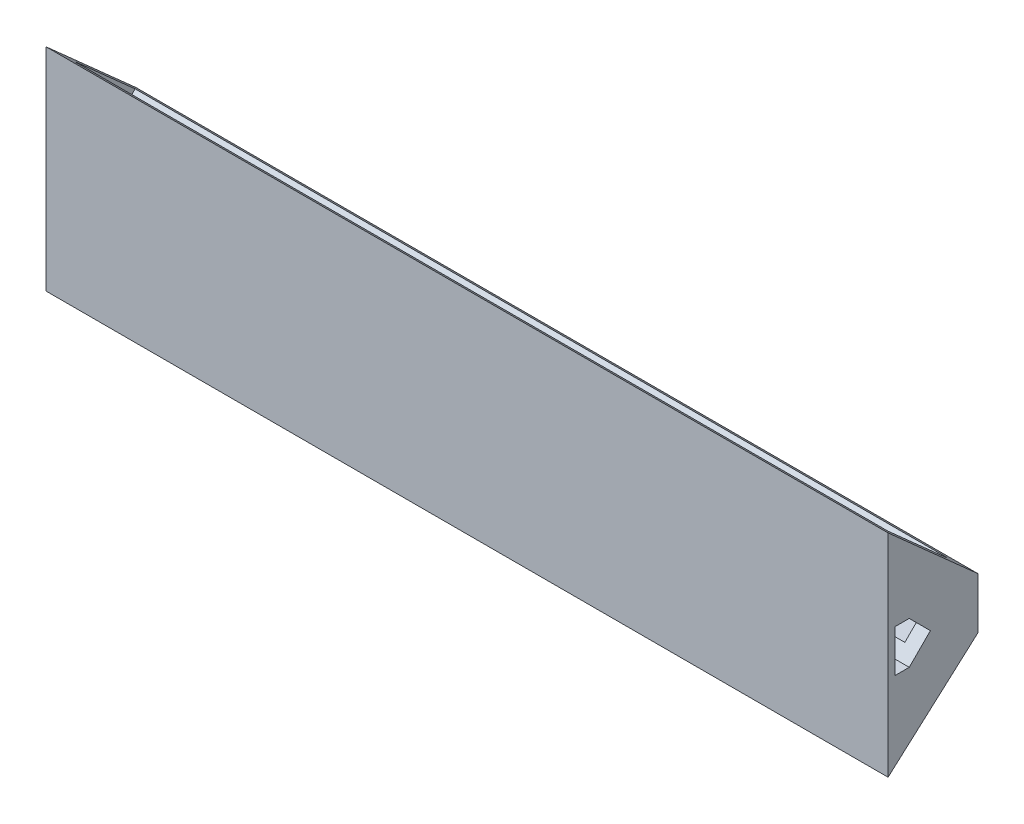
ISO-10303-21;
HEADER;
FILE_DESCRIPTION(('STEP AP214'),'2;1');
FILE_NAME('part.step','',(''),(''),'','','');
FILE_SCHEMA(('AUTOMOTIVE_DESIGN { 1 0 10303 214 1 1 1 1 }'));
ENDSEC;
DATA;
#1=APPLICATION_CONTEXT('core data for automotive mechanical design processes');
#2=APPLICATION_PROTOCOL_DEFINITION('international standard','automotive_design',2000,#1);
#3=PRODUCT_CONTEXT('',#1,'mechanical');
#4=PRODUCT('Part','Part','',(#3));
#5=PRODUCT_RELATED_PRODUCT_CATEGORY('part','',(#4));
#6=PRODUCT_DEFINITION_FORMATION('','',#4);
#7=PRODUCT_DEFINITION_CONTEXT('part definition',#1,'design');
#8=PRODUCT_DEFINITION('design','',#6,#7);
#9=PRODUCT_DEFINITION_SHAPE('','',#8);
#10=(LENGTH_UNIT() NAMED_UNIT(*) SI_UNIT(.MILLI.,.METRE.));
#11=(NAMED_UNIT(*) PLANE_ANGLE_UNIT() SI_UNIT($,.RADIAN.));
#12=(NAMED_UNIT(*) SI_UNIT($,.STERADIAN.) SOLID_ANGLE_UNIT());
#13=UNCERTAINTY_MEASURE_WITH_UNIT(LENGTH_MEASURE(1.E-05),#10,'distance_accuracy_value','');
#14=(GEOMETRIC_REPRESENTATION_CONTEXT(3) GLOBAL_UNCERTAINTY_ASSIGNED_CONTEXT((#13)) GLOBAL_UNIT_ASSIGNED_CONTEXT((#10,
#11,#12)) REPRESENTATION_CONTEXT('',''));
#15=CARTESIAN_POINT('',(0.,0.,0.));
#16=DIRECTION('',(0.,0.,1.));
#17=DIRECTION('',(1.,0.,0.));
#18=AXIS2_PLACEMENT_3D('',#15,#16,#17);
#19=CARTESIAN_POINT('',(119.4,7.24999999999998,0.));
#20=DIRECTION('',(0.,-0.746197209604912,0.665724961510265));
#21=DIRECTION('',(0.,-0.665724961510265,-0.746197209604912));
#22=AXIS2_PLACEMENT_3D('',#19,#20,#21);
#23=PLANE('',#22);
#24=DIRECTION('',(-1.,0.,0.));
#25=VECTOR('',#24,1.);
#26=CARTESIAN_POINT('',(119.4,7.24999999999998,0.));
#27=LINE('',#26,#25);
#28=CARTESIAN_POINT('',(119.4,7.24999999999998,0.));
#29=VERTEX_POINT('',#28);
#30=CARTESIAN_POINT('',(-119.4,7.24999999999998,0.));
#31=VERTEX_POINT('',#30);
#32=EDGE_CURVE('E171',#29,#31,#27,.T.);
#33=ORIENTED_EDGE('',*,*,#32,.T.);
#34=DIRECTION('',(0.,0.665724961510265,0.746197209604912));
#35=VECTOR('',#34,1.);
#36=CARTESIAN_POINT('',(-119.4,7.24999999999998,0.));
#37=LINE('',#36,#35);
#38=CARTESIAN_POINT('',(-119.4,30.,25.5));
#39=VERTEX_POINT('',#38);
#40=EDGE_CURVE('E252',#31,#39,#37,.T.);
#41=ORIENTED_EDGE('',*,*,#40,.T.);
#42=DIRECTION('',(-1.,0.,0.));
#43=VECTOR('',#42,1.);
#44=CARTESIAN_POINT('',(119.4,30.,25.5));
#45=LINE('',#44,#43);
#46=CARTESIAN_POINT('',(119.4,30.,25.5));
#47=VERTEX_POINT('',#46);
#48=EDGE_CURVE('E175',#47,#39,#45,.T.);
#49=ORIENTED_EDGE('',*,*,#48,.F.);
#50=DIRECTION('',(0.,0.665724961510265,0.746197209604912));
#51=VECTOR('',#50,1.);
#52=CARTESIAN_POINT('',(119.4,7.24999999999998,0.));
#53=LINE('',#52,#51);
#54=EDGE_CURVE('E195',#29,#47,#53,.T.);
#55=ORIENTED_EDGE('',*,*,#54,.F.);
#56=EDGE_LOOP('',(#33,#41,#49,#55));
#57=FACE_BOUND('',#56,.T.);
#58=DIRECTION('',(0.,0.665724961510265,0.746197209604912));
#59=VECTOR('',#58,1.);
#60=CARTESIAN_POINT('',(-115.4,4.03687449826062,-3.60152528766389));
#61=LINE('',#60,#59);
#62=CARTESIAN_POINT('',(-115.4,11.0220207253886,4.22797927461143));
#63=VERTEX_POINT('',#62);
#64=CARTESIAN_POINT('',(-115.4,26.4313725490196,21.5));
#65=VERTEX_POINT('',#64);
#66=EDGE_CURVE('E345',#63,#65,#61,.T.);
#67=ORIENTED_EDGE('',*,*,#66,.F.);
#68=DIRECTION('',(-1.,0.,0.));
#69=VECTOR('',#68,1.);
#70=CARTESIAN_POINT('',(119.4,11.0220207253886,4.22797927461143));
#71=LINE('',#70,#69);
#72=CARTESIAN_POINT('',(115.4,11.0220207253886,4.22797927461143));
#73=VERTEX_POINT('',#72);
#74=EDGE_CURVE('E11',#63,#73,#71,.F.);
#75=ORIENTED_EDGE('',*,*,#74,.T.);
#76=DIRECTION('',(0.,0.665724961510265,0.746197209604912));
#77=VECTOR('',#76,1.);
#78=CARTESIAN_POINT('',(115.4,4.03687449826062,-3.60152528766389));
#79=LINE('',#78,#77);
#80=CARTESIAN_POINT('',(115.4,26.4313725490196,21.5));
#81=VERTEX_POINT('',#80);
#82=EDGE_CURVE('E106',#73,#81,#79,.T.);
#83=ORIENTED_EDGE('',*,*,#82,.T.);
#84=DIRECTION('',(-1.,0.,0.));
#85=VECTOR('',#84,1.);
#86=CARTESIAN_POINT('',(119.4,26.4313725490196,21.5));
#87=LINE('',#86,#85);
#88=EDGE_CURVE('E340',#81,#65,#87,.T.);
#89=ORIENTED_EDGE('',*,*,#88,.T.);
#90=EDGE_LOOP('',(#67,#75,#83,#89));
#91=FACE_BOUND('',#90,.T.);
#92=ADVANCED_FACE('F42',(#57,#91),#23,.F.);
#93=CARTESIAN_POINT('',(119.4,-7.25000000000002,0.));
#94=DIRECTION('',(0.,0.746197209604912,0.665724961510264));
#95=DIRECTION('',(0.,-0.665724961510264,0.746197209604912));
#96=AXIS2_PLACEMENT_3D('',#93,#94,#95);
#97=PLANE('',#96);
#98=DIRECTION('',(-1.,0.,0.));
#99=VECTOR('',#98,1.);
#100=CARTESIAN_POINT('',(119.4,-30.,25.5));
#101=LINE('',#100,#99);
#102=CARTESIAN_POINT('',(119.4,-30.,25.5));
#103=VERTEX_POINT('',#102);
#104=CARTESIAN_POINT('',(-119.4,-30.,25.5));
#105=VERTEX_POINT('',#104);
#106=EDGE_CURVE('E179',#103,#105,#101,.T.);
#107=ORIENTED_EDGE('',*,*,#106,.T.);
#108=DIRECTION('',(0.,0.665724961510264,-0.746197209604912));
#109=VECTOR('',#108,1.);
#110=CARTESIAN_POINT('',(-119.4,-7.25000000000002,0.));
#111=LINE('',#110,#109);
#112=CARTESIAN_POINT('',(-119.4,-7.25000000000002,0.));
#113=VERTEX_POINT('',#112);
#114=EDGE_CURVE('E244',#105,#113,#111,.T.);
#115=ORIENTED_EDGE('',*,*,#114,.T.);
#116=DIRECTION('',(-1.,0.,0.));
#117=VECTOR('',#116,1.);
#118=CARTESIAN_POINT('',(119.4,-7.25000000000002,0.));
#119=LINE('',#118,#117);
#120=CARTESIAN_POINT('',(119.4,-7.25000000000002,0.));
#121=VERTEX_POINT('',#120);
#122=EDGE_CURVE('E183',#121,#113,#119,.T.);
#123=ORIENTED_EDGE('',*,*,#122,.F.);
#124=DIRECTION('',(0.,0.665724961510264,-0.746197209604912));
#125=VECTOR('',#124,1.);
#126=CARTESIAN_POINT('',(119.4,-7.25000000000002,0.));
#127=LINE('',#126,#125);
#128=EDGE_CURVE('E187',#103,#121,#127,.T.);
#129=ORIENTED_EDGE('',*,*,#128,.F.);
#130=EDGE_LOOP('',(#107,#115,#123,#129));
#131=FACE_BOUND('',#130,.T.);
#132=DIRECTION('',(-1.,0.,0.));
#133=VECTOR('',#132,1.);
#134=CARTESIAN_POINT('',(119.4,-26.4313725490196,21.5));
#135=LINE('',#134,#133);
#136=CARTESIAN_POINT('',(115.4,-26.4313725490196,21.5));
#137=VERTEX_POINT('',#136);
#138=CARTESIAN_POINT('',(-115.4,-26.4313725490196,21.5));
#139=VERTEX_POINT('',#138);
#140=EDGE_CURVE('E344',#137,#139,#135,.T.);
#141=ORIENTED_EDGE('',*,*,#140,.F.);
#142=DIRECTION('',(0.,0.665724961510264,-0.746197209604912));
#143=VECTOR('',#142,1.);
#144=CARTESIAN_POINT('',(115.4,-4.03687449826065,-3.60152528766391));
#145=LINE('',#144,#143);
#146=CARTESIAN_POINT('',(115.4,-11.0220207253886,4.22797927461142));
#147=VERTEX_POINT('',#146);
#148=EDGE_CURVE('E134',#137,#147,#145,.T.);
#149=ORIENTED_EDGE('',*,*,#148,.T.);
#150=DIRECTION('',(-1.,0.,0.));
#151=VECTOR('',#150,1.);
#152=CARTESIAN_POINT('',(119.4,-11.0220207253886,4.22797927461142));
#153=LINE('',#152,#151);
#154=CARTESIAN_POINT('',(-115.4,-11.0220207253886,4.22797927461142));
#155=VERTEX_POINT('',#154);
#156=EDGE_CURVE('E52',#147,#155,#153,.T.);
#157=ORIENTED_EDGE('',*,*,#156,.T.);
#158=DIRECTION('',(0.,0.665724961510264,-0.746197209604912));
#159=VECTOR('',#158,1.);
#160=CARTESIAN_POINT('',(-115.4,-4.03687449826065,-3.60152528766391));
#161=LINE('',#160,#159);
#162=EDGE_CURVE('E133',#139,#155,#161,.T.);
#163=ORIENTED_EDGE('',*,*,#162,.F.);
#164=EDGE_LOOP('',(#141,#149,#157,#163));
#165=FACE_BOUND('',#164,.T.);
#166=ADVANCED_FACE('F131',(#131,#165),#97,.F.);
#167=CARTESIAN_POINT('',(119.4,7.24999999999998,0.));
#168=DIRECTION('',(0.,0.,1.));
#169=DIRECTION('',(1.,0.,0.));
#170=AXIS2_PLACEMENT_3D('',#167,#168,#169);
#171=PLANE('',#170);
#172=ORIENTED_EDGE('',*,*,#122,.T.);
#173=DIRECTION('',(0.,1.,0.));
#174=VECTOR('',#173,1.);
#175=CARTESIAN_POINT('',(-119.4,7.24999999999998,0.));
#176=LINE('',#175,#174);
#177=EDGE_CURVE('E256',#113,#31,#176,.T.);
#178=ORIENTED_EDGE('',*,*,#177,.T.);
#179=ORIENTED_EDGE('',*,*,#32,.F.);
#180=DIRECTION('',(0.,1.,0.));
#181=VECTOR('',#180,1.);
#182=CARTESIAN_POINT('',(119.4,7.24999999999998,0.));
#183=LINE('',#182,#181);
#184=EDGE_CURVE('E199',#121,#29,#183,.T.);
#185=ORIENTED_EDGE('',*,*,#184,.F.);
#186=EDGE_LOOP('',(#172,#178,#179,#185));
#187=FACE_BOUND('',#186,.T.);
#188=DIRECTION('',(0.,-1.,0.));
#189=VECTOR('',#188,1.);
#190=CARTESIAN_POINT('',(-115.4,3.24999999999998,0.));
#191=LINE('',#190,#189);
#192=CARTESIAN_POINT('',(-115.4,3.24999999999998,0.));
#193=VERTEX_POINT('',#192);
#194=CARTESIAN_POINT('',(-115.4,-3.25000000000002,0.));
#195=VERTEX_POINT('',#194);
#196=EDGE_CURVE('E118',#193,#195,#191,.T.);
#197=ORIENTED_EDGE('',*,*,#196,.T.);
#198=DIRECTION('',(1.,0.,0.));
#199=VECTOR('',#198,1.);
#200=CARTESIAN_POINT('',(-115.4,-3.25000000000002,0.));
#201=LINE('',#200,#199);
#202=CARTESIAN_POINT('',(115.4,-3.25000000000002,0.));
#203=VERTEX_POINT('',#202);
#204=EDGE_CURVE('E312',#195,#203,#201,.T.);
#205=ORIENTED_EDGE('',*,*,#204,.T.);
#206=DIRECTION('',(0.,-1.,0.));
#207=VECTOR('',#206,1.);
#208=CARTESIAN_POINT('',(115.4,3.24999999999998,0.));
#209=LINE('',#208,#207);
#210=CARTESIAN_POINT('',(115.4,3.24999999999998,0.));
#211=VERTEX_POINT('',#210);
#212=EDGE_CURVE('E308',#211,#203,#209,.T.);
#213=ORIENTED_EDGE('',*,*,#212,.F.);
#214=DIRECTION('',(1.,0.,0.));
#215=VECTOR('',#214,1.);
#216=CARTESIAN_POINT('',(-115.4,3.24999999999998,0.));
#217=LINE('',#216,#215);
#218=EDGE_CURVE('E304',#193,#211,#217,.T.);
#219=ORIENTED_EDGE('',*,*,#218,.F.);
#220=EDGE_LOOP('',(#197,#205,#213,#219));
#221=FACE_BOUND('',#220,.T.);
#222=ADVANCED_FACE('F440',(#187,#221),#171,.F.);
#223=CARTESIAN_POINT('',(119.4,-6.,19.5));
#224=DIRECTION('',(0.,0.707106781186546,0.707106781186549));
#225=DIRECTION('',(0.,-0.707106781186549,0.707106781186546));
#226=AXIS2_PLACEMENT_3D('',#223,#224,#225);
#227=PLANE('',#226);
#228=DIRECTION('',(-1.,0.,0.));
#229=VECTOR('',#228,1.);
#230=CARTESIAN_POINT('',(119.4,-3.25000000000002,16.75));
#231=LINE('',#230,#229);
#232=CARTESIAN_POINT('',(115.4,-3.25000000000002,16.75));
#233=VERTEX_POINT('',#232);
#234=CARTESIAN_POINT('',(-115.4,-3.25000000000002,16.75));
#235=VERTEX_POINT('',#234);
#236=EDGE_CURVE('E155',#233,#235,#231,.T.);
#237=ORIENTED_EDGE('',*,*,#236,.T.);
#238=DIRECTION('',(0.,0.707106781186549,-0.707106781186546));
#239=VECTOR('',#238,1.);
#240=CARTESIAN_POINT('',(-115.4,-6.,19.5));
#241=LINE('',#240,#239);
#242=CARTESIAN_POINT('',(-115.4,0.,13.5));
#243=VERTEX_POINT('',#242);
#244=EDGE_CURVE('E280',#235,#243,#241,.T.);
#245=ORIENTED_EDGE('',*,*,#244,.T.);
#246=DIRECTION('',(-1.,0.,0.));
#247=VECTOR('',#246,1.);
#248=CARTESIAN_POINT('',(119.4,0.,13.5));
#249=LINE('',#248,#247);
#250=CARTESIAN_POINT('',(-119.4,0.,13.5));
#251=VERTEX_POINT('',#250);
#252=EDGE_CURVE('E219',#243,#251,#249,.T.);
#253=ORIENTED_EDGE('',*,*,#252,.T.);
#254=DIRECTION('',(0.,0.707106781186549,-0.707106781186546));
#255=VECTOR('',#254,1.);
#256=CARTESIAN_POINT('',(-119.4,-6.,19.5));
#257=LINE('',#256,#255);
#258=CARTESIAN_POINT('',(-119.4,-6.,19.5));
#259=VERTEX_POINT('',#258);
#260=EDGE_CURVE('E264',#259,#251,#257,.T.);
#261=ORIENTED_EDGE('',*,*,#260,.F.);
#262=DIRECTION('',(-1.,0.,0.));
#263=VECTOR('',#262,1.);
#264=CARTESIAN_POINT('',(119.4,-6.,19.5));
#265=LINE('',#264,#263);
#266=CARTESIAN_POINT('',(119.4,-6.,19.5));
#267=VERTEX_POINT('',#266);
#268=EDGE_CURVE('E211',#267,#259,#265,.T.);
#269=ORIENTED_EDGE('',*,*,#268,.F.);
#270=DIRECTION('',(0.,0.707106781186549,-0.707106781186546));
#271=VECTOR('',#270,1.);
#272=CARTESIAN_POINT('',(119.4,-6.,19.5));
#273=LINE('',#272,#271);
#274=CARTESIAN_POINT('',(119.4,0.,13.5));
#275=VERTEX_POINT('',#274);
#276=EDGE_CURVE('E228',#267,#275,#273,.T.);
#277=ORIENTED_EDGE('',*,*,#276,.T.);
#278=CARTESIAN_POINT('',(115.4,0.,13.5));
#279=VERTEX_POINT('',#278);
#280=EDGE_CURVE('E215',#275,#279,#249,.T.);
#281=ORIENTED_EDGE('',*,*,#280,.T.);
#282=DIRECTION('',(0.,0.707106781186549,-0.707106781186546));
#283=VECTOR('',#282,1.);
#284=CARTESIAN_POINT('',(115.4,-6.,19.5));
#285=LINE('',#284,#283);
#286=EDGE_CURVE('E284',#233,#279,#285,.T.);
#287=ORIENTED_EDGE('',*,*,#286,.F.);
#288=EDGE_LOOP('',(#237,#245,#253,#261,#269,#277,#281,#287));
#289=FACE_BOUND('',#288,.T.);
#290=ADVANCED_FACE('F448',(#289),#227,.T.);
#291=CARTESIAN_POINT('',(119.4,6.,19.5));
#292=DIRECTION('',(0.,-0.707106781186546,0.707106781186549));
#293=DIRECTION('',(0.,-0.707106781186549,-0.707106781186546));
#294=AXIS2_PLACEMENT_3D('',#291,#292,#293);
#295=PLANE('',#294);
#296=ORIENTED_EDGE('',*,*,#252,.F.);
#297=DIRECTION('',(0.,0.707106781186549,0.707106781186546));
#298=VECTOR('',#297,1.);
#299=CARTESIAN_POINT('',(-115.4,6.,19.5));
#300=LINE('',#299,#298);
#301=CARTESIAN_POINT('',(-115.4,3.24999999999998,16.75));
#302=VERTEX_POINT('',#301);
#303=EDGE_CURVE('E159',#243,#302,#300,.T.);
#304=ORIENTED_EDGE('',*,*,#303,.T.);
#305=DIRECTION('',(-1.,0.,0.));
#306=VECTOR('',#305,1.);
#307=CARTESIAN_POINT('',(119.4,3.24999999999998,16.75));
#308=LINE('',#307,#306);
#309=CARTESIAN_POINT('',(115.4,3.24999999999998,16.75));
#310=VERTEX_POINT('',#309);
#311=EDGE_CURVE('E167',#310,#302,#308,.T.);
#312=ORIENTED_EDGE('',*,*,#311,.F.);
#313=DIRECTION('',(0.,0.707106781186549,0.707106781186546));
#314=VECTOR('',#313,1.);
#315=CARTESIAN_POINT('',(115.4,6.,19.5));
#316=LINE('',#315,#314);
#317=EDGE_CURVE('E163',#279,#310,#316,.T.);
#318=ORIENTED_EDGE('',*,*,#317,.F.);
#319=ORIENTED_EDGE('',*,*,#280,.F.);
#320=DIRECTION('',(0.,0.707106781186549,0.707106781186546));
#321=VECTOR('',#320,1.);
#322=CARTESIAN_POINT('',(119.4,6.,19.5));
#323=LINE('',#322,#321);
#324=CARTESIAN_POINT('',(119.4,6.,19.5));
#325=VERTEX_POINT('',#324);
#326=EDGE_CURVE('E224',#275,#325,#323,.T.);
#327=ORIENTED_EDGE('',*,*,#326,.T.);
#328=DIRECTION('',(-1.,0.,0.));
#329=VECTOR('',#328,1.);
#330=CARTESIAN_POINT('',(119.4,6.,19.5));
#331=LINE('',#330,#329);
#332=CARTESIAN_POINT('',(-119.4,6.,19.5));
#333=VERTEX_POINT('',#332);
#334=EDGE_CURVE('E220',#325,#333,#331,.T.);
#335=ORIENTED_EDGE('',*,*,#334,.T.);
#336=DIRECTION('',(0.,0.707106781186549,0.707106781186546));
#337=VECTOR('',#336,1.);
#338=CARTESIAN_POINT('',(-119.4,6.,19.5));
#339=LINE('',#338,#337);
#340=EDGE_CURVE('E260',#251,#333,#339,.T.);
#341=ORIENTED_EDGE('',*,*,#340,.F.);
#342=EDGE_LOOP('',(#296,#304,#312,#318,#319,#327,#335,#341));
#343=FACE_BOUND('',#342,.T.);
#344=ADVANCED_FACE('F609',(#343),#295,.T.);
#345=CARTESIAN_POINT('',(119.4,0.,0.));
#346=DIRECTION('',(-1.,0.,0.));
#347=DIRECTION('',(0.,0.,1.));
#348=AXIS2_PLACEMENT_3D('',#345,#346,#347);
#349=PLANE('',#348);
#350=ORIENTED_EDGE('',*,*,#184,.T.);
#351=ORIENTED_EDGE('',*,*,#54,.T.);
#352=DIRECTION('',(0.,-1.,0.));
#353=VECTOR('',#352,1.);
#354=CARTESIAN_POINT('',(119.4,30.,25.5));
#355=LINE('',#354,#353);
#356=EDGE_CURVE('E191',#47,#103,#355,.T.);
#357=ORIENTED_EDGE('',*,*,#356,.T.);
#358=ORIENTED_EDGE('',*,*,#128,.T.);
#359=EDGE_LOOP('',(#350,#351,#357,#358));
#360=FACE_BOUND('',#359,.T.);
#361=DIRECTION('',(0.,0.,1.));
#362=VECTOR('',#361,1.);
#363=CARTESIAN_POINT('',(119.4,6.,23.5));
#364=LINE('',#363,#362);
#365=CARTESIAN_POINT('',(119.4,6.,23.5));
#366=VERTEX_POINT('',#365);
#367=EDGE_CURVE('E240',#325,#366,#364,.T.);
#368=ORIENTED_EDGE('',*,*,#367,.F.);
#369=ORIENTED_EDGE('',*,*,#326,.F.);
#370=ORIENTED_EDGE('',*,*,#276,.F.);
#371=DIRECTION('',(0.,0.,-1.));
#372=VECTOR('',#371,1.);
#373=CARTESIAN_POINT('',(119.4,-6.,23.5));
#374=LINE('',#373,#372);
#375=CARTESIAN_POINT('',(119.4,-6.,23.5));
#376=VERTEX_POINT('',#375);
#377=EDGE_CURVE('E232',#376,#267,#374,.T.);
#378=ORIENTED_EDGE('',*,*,#377,.F.);
#379=DIRECTION('',(0.,-1.,0.));
#380=VECTOR('',#379,1.);
#381=CARTESIAN_POINT('',(119.4,6.,23.5));
#382=LINE('',#381,#380);
#383=EDGE_CURVE('E236',#366,#376,#382,.T.);
#384=ORIENTED_EDGE('',*,*,#383,.F.);
#385=EDGE_LOOP('',(#368,#369,#370,#378,#384));
#386=FACE_BOUND('',#385,.T.);
#387=ADVANCED_FACE('F614',(#360,#386),#349,.F.);
#388=CARTESIAN_POINT('',(119.4,30.,25.5));
#389=DIRECTION('',(0.,0.,-1.));
#390=DIRECTION('',(-1.,0.,0.));
#391=AXIS2_PLACEMENT_3D('',#388,#389,#390);
#392=PLANE('',#391);
#393=ORIENTED_EDGE('',*,*,#48,.T.);
#394=DIRECTION('',(0.,-1.,0.));
#395=VECTOR('',#394,1.);
#396=CARTESIAN_POINT('',(-119.4,30.,25.5));
#397=LINE('',#396,#395);
#398=EDGE_CURVE('E248',#39,#105,#397,.T.);
#399=ORIENTED_EDGE('',*,*,#398,.T.);
#400=ORIENTED_EDGE('',*,*,#106,.F.);
#401=ORIENTED_EDGE('',*,*,#356,.F.);
#402=EDGE_LOOP('',(#393,#399,#400,#401));
#403=FACE_BOUND('',#402,.T.);
#404=ADVANCED_FACE('F446',(#403),#392,.F.);
#405=CARTESIAN_POINT('',(119.4,6.,23.5));
#406=DIRECTION('',(0.,-1.,0.));
#407=DIRECTION('',(0.,0.,-1.));
#408=AXIS2_PLACEMENT_3D('',#405,#406,#407);
#409=PLANE('',#408);
#410=DIRECTION('',(-1.,0.,0.));
#411=VECTOR('',#410,1.);
#412=CARTESIAN_POINT('',(119.4,6.,23.5));
#413=LINE('',#412,#411);
#414=CARTESIAN_POINT('',(-119.4,6.,23.5));
#415=VERTEX_POINT('',#414);
#416=EDGE_CURVE('E203',#366,#415,#413,.T.);
#417=ORIENTED_EDGE('',*,*,#416,.T.);
#418=DIRECTION('',(0.,0.,1.));
#419=VECTOR('',#418,1.);
#420=CARTESIAN_POINT('',(-119.4,6.,23.5));
#421=LINE('',#420,#419);
#422=EDGE_CURVE('E276',#333,#415,#421,.T.);
#423=ORIENTED_EDGE('',*,*,#422,.F.);
#424=ORIENTED_EDGE('',*,*,#334,.F.);
#425=ORIENTED_EDGE('',*,*,#367,.T.);
#426=EDGE_LOOP('',(#417,#423,#424,#425));
#427=FACE_BOUND('',#426,.T.);
#428=ADVANCED_FACE('F658',(#427),#409,.T.);
#429=CARTESIAN_POINT('',(119.4,6.,23.5));
#430=DIRECTION('',(0.,0.,-1.));
#431=DIRECTION('',(0.,1.,0.));
#432=AXIS2_PLACEMENT_3D('',#429,#430,#431);
#433=PLANE('',#432);
#434=DIRECTION('',(-1.,0.,0.));
#435=VECTOR('',#434,1.);
#436=CARTESIAN_POINT('',(119.4,-6.,23.5));
#437=LINE('',#436,#435);
#438=CARTESIAN_POINT('',(-119.4,-6.,23.5));
#439=VERTEX_POINT('',#438);
#440=EDGE_CURVE('E207',#376,#439,#437,.T.);
#441=ORIENTED_EDGE('',*,*,#440,.T.);
#442=DIRECTION('',(0.,-1.,0.));
#443=VECTOR('',#442,1.);
#444=CARTESIAN_POINT('',(-119.4,6.,23.5));
#445=LINE('',#444,#443);
#446=EDGE_CURVE('E272',#415,#439,#445,.T.);
#447=ORIENTED_EDGE('',*,*,#446,.F.);
#448=ORIENTED_EDGE('',*,*,#416,.F.);
#449=ORIENTED_EDGE('',*,*,#383,.T.);
#450=EDGE_LOOP('',(#441,#447,#448,#449));
#451=FACE_BOUND('',#450,.T.);
#452=ADVANCED_FACE('F648',(#451),#433,.T.);
#453=CARTESIAN_POINT('',(119.4,-6.,23.5));
#454=DIRECTION('',(0.,1.,0.));
#455=DIRECTION('',(0.,0.,1.));
#456=AXIS2_PLACEMENT_3D('',#453,#454,#455);
#457=PLANE('',#456);
#458=ORIENTED_EDGE('',*,*,#268,.T.);
#459=DIRECTION('',(0.,0.,-1.));
#460=VECTOR('',#459,1.);
#461=CARTESIAN_POINT('',(-119.4,-6.,23.5));
#462=LINE('',#461,#460);
#463=EDGE_CURVE('E268',#439,#259,#462,.T.);
#464=ORIENTED_EDGE('',*,*,#463,.F.);
#465=ORIENTED_EDGE('',*,*,#440,.F.);
#466=ORIENTED_EDGE('',*,*,#377,.T.);
#467=EDGE_LOOP('',(#458,#464,#465,#466));
#468=FACE_BOUND('',#467,.T.);
#469=ADVANCED_FACE('F638',(#468),#457,.T.);
#470=CARTESIAN_POINT('',(-119.4,0.,0.));
#471=DIRECTION('',(-1.,0.,0.));
#472=DIRECTION('',(0.,0.,1.));
#473=AXIS2_PLACEMENT_3D('',#470,#471,#472);
#474=PLANE('',#473);
#475=ORIENTED_EDGE('',*,*,#422,.T.);
#476=ORIENTED_EDGE('',*,*,#446,.T.);
#477=ORIENTED_EDGE('',*,*,#463,.T.);
#478=ORIENTED_EDGE('',*,*,#260,.T.);
#479=ORIENTED_EDGE('',*,*,#340,.T.);
#480=EDGE_LOOP('',(#475,#476,#477,#478,#479));
#481=FACE_BOUND('',#480,.T.);
#482=ORIENTED_EDGE('',*,*,#177,.F.);
#483=ORIENTED_EDGE('',*,*,#114,.F.);
#484=ORIENTED_EDGE('',*,*,#398,.F.);
#485=ORIENTED_EDGE('',*,*,#40,.F.);
#486=EDGE_LOOP('',(#482,#483,#484,#485));
#487=FACE_BOUND('',#486,.T.);
#488=ADVANCED_FACE('F601',(#481,#487),#474,.T.);
#489=CARTESIAN_POINT('',(-115.4,3.24999999999998,20.));
#490=DIRECTION('',(1.,0.,0.));
#491=DIRECTION('',(0.,0.,-1.));
#492=AXIS2_PLACEMENT_3D('',#489,#490,#491);
#493=PLANE('',#492);
#494=DIRECTION('',(0.,0.,-1.));
#495=VECTOR('',#494,1.);
#496=CARTESIAN_POINT('',(-115.4,-3.25000000000002,20.));
#497=LINE('',#496,#495);
#498=EDGE_CURVE('E288',#235,#195,#497,.T.);
#499=ORIENTED_EDGE('',*,*,#498,.T.);
#500=ORIENTED_EDGE('',*,*,#196,.F.);
#501=DIRECTION('',(0.,0.,-1.));
#502=VECTOR('',#501,1.);
#503=CARTESIAN_POINT('',(-115.4,3.24999999999998,20.));
#504=LINE('',#503,#502);
#505=EDGE_CURVE('E300',#302,#193,#504,.T.);
#506=ORIENTED_EDGE('',*,*,#505,.F.);
#507=ORIENTED_EDGE('',*,*,#303,.F.);
#508=ORIENTED_EDGE('',*,*,#244,.F.);
#509=EDGE_LOOP('',(#499,#500,#506,#507,#508));
#510=FACE_BOUND('',#509,.T.);
#511=ADVANCED_FACE('F591',(#510),#493,.T.);
#512=CARTESIAN_POINT('',(-115.4,-3.25000000000002,20.));
#513=DIRECTION('',(0.,1.,0.));
#514=DIRECTION('',(0.,0.,1.));
#515=AXIS2_PLACEMENT_3D('',#512,#513,#514);
#516=PLANE('',#515);
#517=DIRECTION('',(0.,0.,-1.));
#518=VECTOR('',#517,1.);
#519=CARTESIAN_POINT('',(115.4,-3.25000000000002,20.));
#520=LINE('',#519,#518);
#521=EDGE_CURVE('E292',#233,#203,#520,.T.);
#522=ORIENTED_EDGE('',*,*,#521,.T.);
#523=ORIENTED_EDGE('',*,*,#204,.F.);
#524=ORIENTED_EDGE('',*,*,#498,.F.);
#525=ORIENTED_EDGE('',*,*,#236,.F.);
#526=EDGE_LOOP('',(#522,#523,#524,#525));
#527=FACE_BOUND('',#526,.T.);
#528=ADVANCED_FACE('F581',(#527),#516,.T.);
#529=CARTESIAN_POINT('',(115.4,3.24999999999998,20.));
#530=DIRECTION('',(1.,0.,0.));
#531=DIRECTION('',(0.,0.,-1.));
#532=AXIS2_PLACEMENT_3D('',#529,#530,#531);
#533=PLANE('',#532);
#534=ORIENTED_EDGE('',*,*,#286,.T.);
#535=ORIENTED_EDGE('',*,*,#317,.T.);
#536=DIRECTION('',(0.,0.,-1.));
#537=VECTOR('',#536,1.);
#538=CARTESIAN_POINT('',(115.4,3.24999999999998,20.));
#539=LINE('',#538,#537);
#540=EDGE_CURVE('E296',#310,#211,#539,.T.);
#541=ORIENTED_EDGE('',*,*,#540,.T.);
#542=ORIENTED_EDGE('',*,*,#212,.T.);
#543=ORIENTED_EDGE('',*,*,#521,.F.);
#544=EDGE_LOOP('',(#534,#535,#541,#542,#543));
#545=FACE_BOUND('',#544,.T.);
#546=ADVANCED_FACE('F571',(#545),#533,.F.);
#547=CARTESIAN_POINT('',(-115.4,3.24999999999998,20.));
#548=DIRECTION('',(0.,1.,0.));
#549=DIRECTION('',(0.,0.,1.));
#550=AXIS2_PLACEMENT_3D('',#547,#548,#549);
#551=PLANE('',#550);
#552=ORIENTED_EDGE('',*,*,#311,.T.);
#553=ORIENTED_EDGE('',*,*,#505,.T.);
#554=ORIENTED_EDGE('',*,*,#218,.T.);
#555=ORIENTED_EDGE('',*,*,#540,.F.);
#556=EDGE_LOOP('',(#552,#553,#554,#555));
#557=FACE_BOUND('',#556,.T.);
#558=ADVANCED_FACE('F514',(#557),#551,.F.);
#559=CARTESIAN_POINT('',(-115.4,0.,0.));
#560=DIRECTION('',(-1.,0.,0.));
#561=DIRECTION('',(0.,0.,1.));
#562=AXIS2_PLACEMENT_3D('',#559,#560,#561);
#563=PLANE('',#562);
#564=ORIENTED_EDGE('',*,*,#162,.T.);
#565=DIRECTION('',(0.,0.707106781186544,0.707106781186551));
#566=VECTOR('',#565,1.);
#567=CARTESIAN_POINT('',(-115.4,-7.25000000000002,8.00000000000007));
#568=LINE('',#567,#566);
#569=CARTESIAN_POINT('',(-115.4,-7.25000000000002,8.00000000000007));
#570=VERTEX_POINT('',#569);
#571=EDGE_CURVE('E109',#155,#570,#568,.T.);
#572=ORIENTED_EDGE('',*,*,#571,.T.);
#573=DIRECTION('',(0.,0.,-1.));
#574=VECTOR('',#573,1.);
#575=CARTESIAN_POINT('',(-115.4,-7.25000000000002,0.));
#576=LINE('',#575,#574);
#577=CARTESIAN_POINT('',(-115.4,-7.25000000000002,15.0931457505076));
#578=VERTEX_POINT('',#577);
#579=EDGE_CURVE('E321',#578,#570,#576,.T.);
#580=ORIENTED_EDGE('',*,*,#579,.F.);
#581=DIRECTION('',(0.,0.707106781186549,-0.707106781186546));
#582=VECTOR('',#581,1.);
#583=CARTESIAN_POINT('',(-115.4,3.92157287525382,3.92157287525384));
#584=LINE('',#583,#582);
#585=CARTESIAN_POINT('',(-115.4,-10.,17.8431457505076));
#586=VERTEX_POINT('',#585);
#587=EDGE_CURVE('E362',#586,#578,#584,.T.);
#588=ORIENTED_EDGE('',*,*,#587,.F.);
#589=DIRECTION('',(0.,0.,-1.));
#590=VECTOR('',#589,1.);
#591=CARTESIAN_POINT('',(-115.4,-9.99999999999998,0.));
#592=LINE('',#591,#590);
#593=CARTESIAN_POINT('',(-115.4,-10.,21.5));
#594=VERTEX_POINT('',#593);
#595=EDGE_CURVE('E358',#594,#586,#592,.T.);
#596=ORIENTED_EDGE('',*,*,#595,.F.);
#597=DIRECTION('',(0.,-1.,0.));
#598=VECTOR('',#597,1.);
#599=CARTESIAN_POINT('',(-115.4,0.,21.5));
#600=LINE('',#599,#598);
#601=EDGE_CURVE('E143',#594,#139,#600,.T.);
#602=ORIENTED_EDGE('',*,*,#601,.T.);
#603=EDGE_LOOP('',(#564,#572,#580,#588,#596,#602));
#604=FACE_BOUND('',#603,.T.);
#605=ADVANCED_FACE('F138',(#604),#563,.F.);
#606=CARTESIAN_POINT('',(119.4,30.,21.5));
#607=DIRECTION('',(0.,0.,-1.));
#608=DIRECTION('',(-1.,0.,0.));
#609=AXIS2_PLACEMENT_3D('',#606,#607,#608);
#610=PLANE('',#609);
#611=DIRECTION('',(0.,-1.,0.));
#612=VECTOR('',#611,1.);
#613=CARTESIAN_POINT('',(115.4,0.,21.5));
#614=LINE('',#613,#612);
#615=CARTESIAN_POINT('',(115.4,-10.,21.5));
#616=VERTEX_POINT('',#615);
#617=EDGE_CURVE('E338',#616,#137,#614,.T.);
#618=ORIENTED_EDGE('',*,*,#617,.T.);
#619=ORIENTED_EDGE('',*,*,#140,.T.);
#620=ORIENTED_EDGE('',*,*,#601,.F.);
#621=DIRECTION('',(-1.,0.,0.));
#622=VECTOR('',#621,1.);
#623=CARTESIAN_POINT('',(119.4,-10.,21.5));
#624=LINE('',#623,#622);
#625=EDGE_CURVE('E327',#616,#594,#624,.T.);
#626=ORIENTED_EDGE('',*,*,#625,.F.);
#627=EDGE_LOOP('',(#618,#619,#620,#626));
#628=FACE_BOUND('',#627,.T.);
#629=ADVANCED_FACE('F410',(#628),#610,.T.);
#630=CARTESIAN_POINT('',(119.4,-8.82842712474618,16.6715728752538));
#631=DIRECTION('',(0.,0.707106781186546,0.707106781186549));
#632=DIRECTION('',(0.,-0.707106781186549,0.707106781186546));
#633=AXIS2_PLACEMENT_3D('',#630,#631,#632);
#634=PLANE('',#633);
#635=DIRECTION('',(0.,0.707106781186549,-0.707106781186546));
#636=VECTOR('',#635,1.);
#637=CARTESIAN_POINT('',(115.4,3.92157287525382,3.92157287525384));
#638=LINE('',#637,#636);
#639=CARTESIAN_POINT('',(115.4,-10.,17.8431457505076));
#640=VERTEX_POINT('',#639);
#641=CARTESIAN_POINT('',(115.4,-7.25000000000002,15.0931457505076));
#642=VERTEX_POINT('',#641);
#643=EDGE_CURVE('E390',#640,#642,#638,.T.);
#644=ORIENTED_EDGE('',*,*,#643,.F.);
#645=DIRECTION('',(-1.,0.,0.));
#646=VECTOR('',#645,1.);
#647=CARTESIAN_POINT('',(119.4,-10.,17.8431457505076));
#648=LINE('',#647,#646);
#649=EDGE_CURVE('E339',#640,#586,#648,.T.);
#650=ORIENTED_EDGE('',*,*,#649,.T.);
#651=ORIENTED_EDGE('',*,*,#587,.T.);
#652=DIRECTION('',(-1.,0.,0.));
#653=VECTOR('',#652,1.);
#654=CARTESIAN_POINT('',(119.4,-7.25000000000002,15.0931457505076));
#655=LINE('',#654,#653);
#656=EDGE_CURVE('E335',#642,#578,#655,.T.);
#657=ORIENTED_EDGE('',*,*,#656,.F.);
#658=EDGE_LOOP('',(#644,#650,#651,#657));
#659=FACE_BOUND('',#658,.T.);
#660=ADVANCED_FACE('F419',(#659),#634,.F.);
#661=CARTESIAN_POINT('',(115.4,0.,0.));
#662=DIRECTION('',(-1.,0.,0.));
#663=DIRECTION('',(0.,0.,1.));
#664=AXIS2_PLACEMENT_3D('',#661,#662,#663);
#665=PLANE('',#664);
#666=DIRECTION('',(0.,0.,-1.));
#667=VECTOR('',#666,1.);
#668=CARTESIAN_POINT('',(115.4,-7.25000000000002,0.));
#669=LINE('',#668,#667);
#670=CARTESIAN_POINT('',(115.4,-7.25000000000002,8.00000000000007));
#671=VERTEX_POINT('',#670);
#672=EDGE_CURVE('E119',#642,#671,#669,.T.);
#673=ORIENTED_EDGE('',*,*,#672,.T.);
#674=DIRECTION('',(0.,-0.707106781186544,-0.707106781186551));
#675=VECTOR('',#674,1.);
#676=CARTESIAN_POINT('',(115.4,-7.62500000000008,7.62500000000001));
#677=LINE('',#676,#675);
#678=EDGE_CURVE('E78',#671,#147,#677,.T.);
#679=ORIENTED_EDGE('',*,*,#678,.T.);
#680=ORIENTED_EDGE('',*,*,#148,.F.);
#681=ORIENTED_EDGE('',*,*,#617,.F.);
#682=DIRECTION('',(0.,0.,-1.));
#683=VECTOR('',#682,1.);
#684=CARTESIAN_POINT('',(115.4,-9.99999999999998,0.));
#685=LINE('',#684,#683);
#686=EDGE_CURVE('E386',#616,#640,#685,.T.);
#687=ORIENTED_EDGE('',*,*,#686,.T.);
#688=ORIENTED_EDGE('',*,*,#643,.T.);
#689=EDGE_LOOP('',(#673,#679,#680,#681,#687,#688));
#690=FACE_BOUND('',#689,.T.);
#691=ADVANCED_FACE('F415',(#690),#665,.T.);
#692=CARTESIAN_POINT('',(119.4,-10.,23.5));
#693=DIRECTION('',(0.,1.,0.));
#694=DIRECTION('',(0.,0.,1.));
#695=AXIS2_PLACEMENT_3D('',#692,#693,#694);
#696=PLANE('',#695);
#697=ORIENTED_EDGE('',*,*,#625,.T.);
#698=ORIENTED_EDGE('',*,*,#595,.T.);
#699=ORIENTED_EDGE('',*,*,#649,.F.);
#700=ORIENTED_EDGE('',*,*,#686,.F.);
#701=EDGE_LOOP('',(#697,#698,#699,#700));
#702=FACE_BOUND('',#701,.T.);
#703=ADVANCED_FACE('F418',(#702),#696,.F.);
#704=CARTESIAN_POINT('',(-115.4,-7.25000000000002,20.));
#705=DIRECTION('',(0.,1.,0.));
#706=DIRECTION('',(0.,0.,1.));
#707=AXIS2_PLACEMENT_3D('',#704,#705,#706);
#708=PLANE('',#707);
#709=ORIENTED_EDGE('',*,*,#579,.T.);
#710=DIRECTION('',(1.,0.,0.));
#711=VECTOR('',#710,1.);
#712=CARTESIAN_POINT('',(-115.4,-7.25000000000002,8.00000000000007));
#713=LINE('',#712,#711);
#714=EDGE_CURVE('E148',#570,#671,#713,.T.);
#715=ORIENTED_EDGE('',*,*,#714,.T.);
#716=ORIENTED_EDGE('',*,*,#672,.F.);
#717=ORIENTED_EDGE('',*,*,#656,.T.);
#718=EDGE_LOOP('',(#709,#715,#716,#717));
#719=FACE_BOUND('',#718,.T.);
#720=ADVANCED_FACE('F425',(#719),#708,.F.);
#721=CARTESIAN_POINT('',(-115.4,7.24999999999998,20.));
#722=DIRECTION('',(0.,1.,0.));
#723=DIRECTION('',(0.,0.,1.));
#724=AXIS2_PLACEMENT_3D('',#721,#722,#723);
#725=PLANE('',#724);
#726=DIRECTION('',(0.,0.,1.));
#727=VECTOR('',#726,1.);
#728=CARTESIAN_POINT('',(115.4,7.24999999999998,20.));
#729=LINE('',#728,#727);
#730=CARTESIAN_POINT('',(115.4,7.24999999999998,8.00000000000003));
#731=VERTEX_POINT('',#730);
#732=CARTESIAN_POINT('',(115.4,7.24999999999998,15.0931457505076));
#733=VERTEX_POINT('',#732);
#734=EDGE_CURVE('E102',#731,#733,#729,.T.);
#735=ORIENTED_EDGE('',*,*,#734,.F.);
#736=DIRECTION('',(-1.,0.,0.));
#737=VECTOR('',#736,1.);
#738=CARTESIAN_POINT('',(-115.4,7.24999999999998,8.00000000000003));
#739=LINE('',#738,#737);
#740=CARTESIAN_POINT('',(-115.4,7.24999999999998,8.00000000000003));
#741=VERTEX_POINT('',#740);
#742=EDGE_CURVE('E108',#731,#741,#739,.T.);
#743=ORIENTED_EDGE('',*,*,#742,.T.);
#744=DIRECTION('',(0.,0.,1.));
#745=VECTOR('',#744,1.);
#746=CARTESIAN_POINT('',(-115.4,7.24999999999998,20.));
#747=LINE('',#746,#745);
#748=CARTESIAN_POINT('',(-115.4,7.24999999999998,15.0931457505076));
#749=VERTEX_POINT('',#748);
#750=EDGE_CURVE('E324',#741,#749,#747,.T.);
#751=ORIENTED_EDGE('',*,*,#750,.T.);
#752=DIRECTION('',(-1.,0.,0.));
#753=VECTOR('',#752,1.);
#754=CARTESIAN_POINT('',(119.4,7.24999999999998,15.0931457505076));
#755=LINE('',#754,#753);
#756=EDGE_CURVE('E116',#733,#749,#755,.T.);
#757=ORIENTED_EDGE('',*,*,#756,.F.);
#758=EDGE_LOOP('',(#735,#743,#751,#757));
#759=FACE_BOUND('',#758,.T.);
#760=ADVANCED_FACE('F113',(#759),#725,.T.);
#761=ORIENTED_EDGE('',*,*,#750,.F.);
#762=DIRECTION('',(0.,-0.707106781186551,0.707106781186544));
#763=VECTOR('',#762,1.);
#764=CARTESIAN_POINT('',(-115.4,11.25,4.));
#765=LINE('',#764,#763);
#766=EDGE_CURVE('E59',#741,#63,#765,.F.);
#767=ORIENTED_EDGE('',*,*,#766,.T.);
#768=ORIENTED_EDGE('',*,*,#66,.T.);
#769=CARTESIAN_POINT('',(-115.4,10.,21.5));
#770=VERTEX_POINT('',#769);
#771=EDGE_CURVE('E347',#65,#770,#600,.T.);
#772=ORIENTED_EDGE('',*,*,#771,.T.);
#773=DIRECTION('',(0.,0.,1.));
#774=VECTOR('',#773,1.);
#775=CARTESIAN_POINT('',(-115.4,10.,0.));
#776=LINE('',#775,#774);
#777=CARTESIAN_POINT('',(-115.4,10.,17.8431457505076));
#778=VERTEX_POINT('',#777);
#779=EDGE_CURVE('E363',#778,#770,#776,.T.);
#780=ORIENTED_EDGE('',*,*,#779,.F.);
#781=DIRECTION('',(0.,0.707106781186549,0.707106781186546));
#782=VECTOR('',#781,1.);
#783=CARTESIAN_POINT('',(-115.4,-3.92157287525382,3.92157287525384));
#784=LINE('',#783,#782);
#785=EDGE_CURVE('E348',#749,#778,#784,.T.);
#786=ORIENTED_EDGE('',*,*,#785,.F.);
#787=EDGE_LOOP('',(#761,#767,#768,#772,#780,#786));
#788=FACE_BOUND('',#787,.T.);
#789=ADVANCED_FACE('F478',(#788),#563,.F.);
#790=CARTESIAN_POINT('',(119.4,10.,23.5));
#791=DIRECTION('',(0.,-1.,0.));
#792=DIRECTION('',(0.,0.,-1.));
#793=AXIS2_PLACEMENT_3D('',#790,#791,#792);
#794=PLANE('',#793);
#795=DIRECTION('',(0.,0.,1.));
#796=VECTOR('',#795,1.);
#797=CARTESIAN_POINT('',(115.4,10.,0.));
#798=LINE('',#797,#796);
#799=CARTESIAN_POINT('',(115.4,10.,17.8431457505076));
#800=VERTEX_POINT('',#799);
#801=CARTESIAN_POINT('',(115.4,10.,21.5));
#802=VERTEX_POINT('',#801);
#803=EDGE_CURVE('E145',#800,#802,#798,.T.);
#804=ORIENTED_EDGE('',*,*,#803,.F.);
#805=DIRECTION('',(-1.,0.,0.));
#806=VECTOR('',#805,1.);
#807=CARTESIAN_POINT('',(119.4,10.,17.8431457505076));
#808=LINE('',#807,#806);
#809=EDGE_CURVE('E370',#800,#778,#808,.T.);
#810=ORIENTED_EDGE('',*,*,#809,.T.);
#811=ORIENTED_EDGE('',*,*,#779,.T.);
#812=DIRECTION('',(-1.,0.,0.));
#813=VECTOR('',#812,1.);
#814=CARTESIAN_POINT('',(119.4,10.,21.5));
#815=LINE('',#814,#813);
#816=EDGE_CURVE('E331',#802,#770,#815,.T.);
#817=ORIENTED_EDGE('',*,*,#816,.F.);
#818=EDGE_LOOP('',(#804,#810,#811,#817));
#819=FACE_BOUND('',#818,.T.);
#820=ADVANCED_FACE('F483',(#819),#794,.F.);
#821=ORIENTED_EDGE('',*,*,#816,.T.);
#822=ORIENTED_EDGE('',*,*,#771,.F.);
#823=ORIENTED_EDGE('',*,*,#88,.F.);
#824=EDGE_CURVE('E355',#81,#802,#614,.T.);
#825=ORIENTED_EDGE('',*,*,#824,.T.);
#826=EDGE_LOOP('',(#821,#822,#823,#825));
#827=FACE_BOUND('',#826,.T.);
#828=ADVANCED_FACE('F534',(#827),#610,.T.);
#829=CARTESIAN_POINT('',(119.4,8.82842712474618,16.6715728752538));
#830=DIRECTION('',(0.,-0.707106781186546,0.707106781186549));
#831=DIRECTION('',(0.,-0.707106781186549,-0.707106781186546));
#832=AXIS2_PLACEMENT_3D('',#829,#830,#831);
#833=PLANE('',#832);
#834=ORIENTED_EDGE('',*,*,#785,.T.);
#835=ORIENTED_EDGE('',*,*,#809,.F.);
#836=DIRECTION('',(0.,0.707106781186549,0.707106781186546));
#837=VECTOR('',#836,1.);
#838=CARTESIAN_POINT('',(115.4,-3.92157287525382,3.92157287525384));
#839=LINE('',#838,#837);
#840=EDGE_CURVE('E374',#733,#800,#839,.T.);
#841=ORIENTED_EDGE('',*,*,#840,.F.);
#842=ORIENTED_EDGE('',*,*,#756,.T.);
#843=EDGE_LOOP('',(#834,#835,#841,#842));
#844=FACE_BOUND('',#843,.T.);
#845=ADVANCED_FACE('F433',(#844),#833,.F.);
#846=ORIENTED_EDGE('',*,*,#82,.F.);
#847=DIRECTION('',(0.,0.707106781186551,-0.707106781186544));
#848=VECTOR('',#847,1.);
#849=CARTESIAN_POINT('',(115.4,7.62499999999996,7.62500000000005));
#850=LINE('',#849,#848);
#851=EDGE_CURVE('E97',#73,#731,#850,.F.);
#852=ORIENTED_EDGE('',*,*,#851,.T.);
#853=ORIENTED_EDGE('',*,*,#734,.T.);
#854=ORIENTED_EDGE('',*,*,#840,.T.);
#855=ORIENTED_EDGE('',*,*,#803,.T.);
#856=ORIENTED_EDGE('',*,*,#824,.F.);
#857=EDGE_LOOP('',(#846,#852,#853,#854,#855,#856));
#858=FACE_BOUND('',#857,.T.);
#859=ADVANCED_FACE('F99',(#858),#665,.T.);
#860=CARTESIAN_POINT('',(-115.4,-7.25000000000002,8.00000000000007));
#861=DIRECTION('',(0.,0.707106781186551,-0.707106781186544));
#862=DIRECTION('',(1.,0.,0.));
#863=AXIS2_PLACEMENT_3D('',#860,#861,#862);
#864=PLANE('',#863);
#865=ORIENTED_EDGE('',*,*,#571,.F.);
#866=ORIENTED_EDGE('',*,*,#156,.F.);
#867=ORIENTED_EDGE('',*,*,#678,.F.);
#868=ORIENTED_EDGE('',*,*,#714,.F.);
#869=EDGE_LOOP('',(#865,#866,#867,#868));
#870=FACE_BOUND('',#869,.T.);
#871=ADVANCED_FACE('F147',(#870),#864,.F.);
#872=CARTESIAN_POINT('',(119.4,11.25,4.));
#873=DIRECTION('',(0.,0.707106781186544,0.707106781186551));
#874=DIRECTION('',(-1.,0.,0.));
#875=AXIS2_PLACEMENT_3D('',#872,#873,#874);
#876=PLANE('',#875);
#877=ORIENTED_EDGE('',*,*,#766,.F.);
#878=ORIENTED_EDGE('',*,*,#742,.F.);
#879=ORIENTED_EDGE('',*,*,#851,.F.);
#880=ORIENTED_EDGE('',*,*,#74,.F.);
#881=EDGE_LOOP('',(#877,#878,#879,#880));
#882=FACE_BOUND('',#881,.T.);
#883=ADVANCED_FACE('F45',(#882),#876,.T.);
#884=CLOSED_SHELL('',(#92,#166,#222,#290,#344,#387,#404,#428,#452,#469,#488,#511,#528,#546,#558,
#605,#629,#660,#691,#703,#720,#760,#789,#820,#828,#845,#859,#871,#883));
#885=MANIFOLD_SOLID_BREP('B2',#884);
#886=ADVANCED_BREP_SHAPE_REPRESENTATION('',(#18,#885),#14);
#887=SHAPE_DEFINITION_REPRESENTATION(#9,#886);
ENDSEC;
END-ISO-10303-21;
